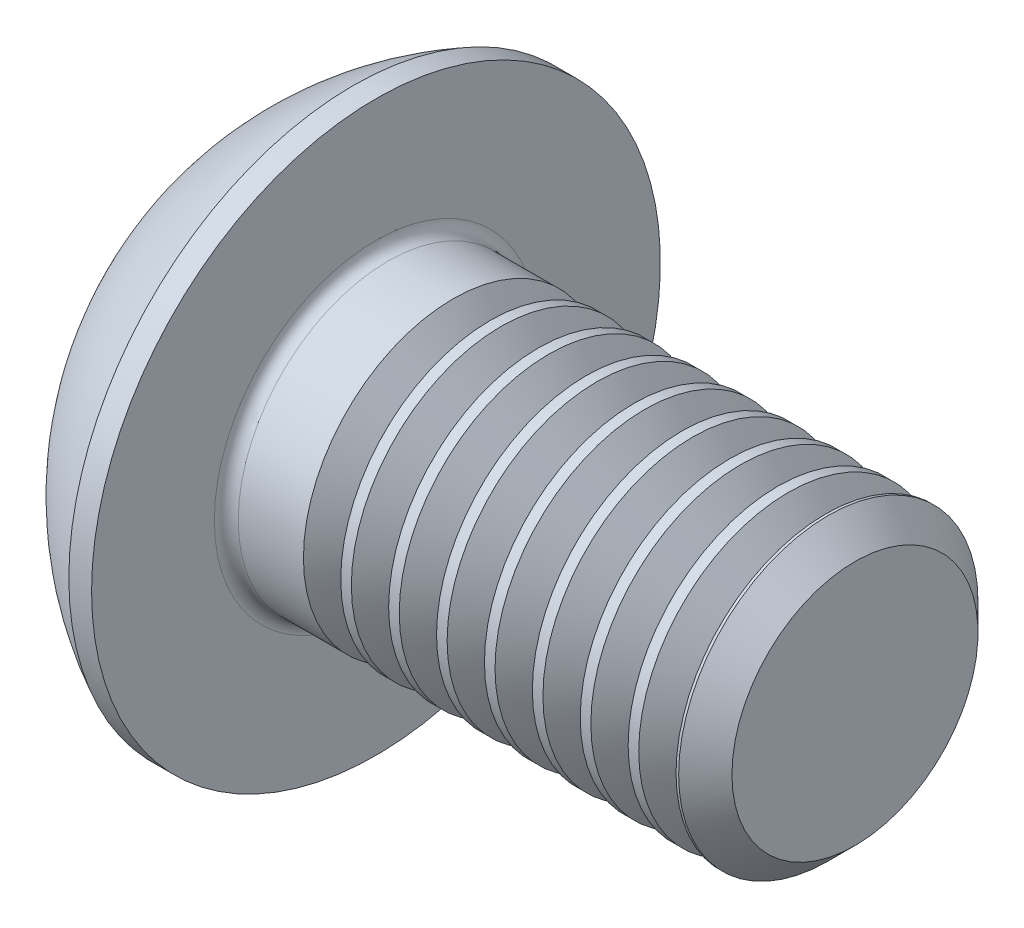
ISO-10303-21;
HEADER;
FILE_DESCRIPTION(('STEP AP214'),'2;1');
FILE_NAME('part.step','',(''),(''),'','','');
FILE_SCHEMA(('AUTOMOTIVE_DESIGN { 1 0 10303 214 1 1 1 1 }'));
ENDSEC;
DATA;
#1=APPLICATION_CONTEXT('core data for automotive mechanical design processes');
#2=APPLICATION_PROTOCOL_DEFINITION('international standard','automotive_design',2000,#1);
#3=PRODUCT_CONTEXT('',#1,'mechanical');
#4=PRODUCT('Part','Part','',(#3));
#5=PRODUCT_RELATED_PRODUCT_CATEGORY('part','',(#4));
#6=PRODUCT_DEFINITION_FORMATION('','',#4);
#7=PRODUCT_DEFINITION_CONTEXT('part definition',#1,'design');
#8=PRODUCT_DEFINITION('design','',#6,#7);
#9=PRODUCT_DEFINITION_SHAPE('','',#8);
#10=(LENGTH_UNIT() NAMED_UNIT(*) SI_UNIT(.MILLI.,.METRE.));
#11=(NAMED_UNIT(*) PLANE_ANGLE_UNIT() SI_UNIT($,.RADIAN.));
#12=(NAMED_UNIT(*) SI_UNIT($,.STERADIAN.) SOLID_ANGLE_UNIT());
#13=UNCERTAINTY_MEASURE_WITH_UNIT(LENGTH_MEASURE(1.E-05),#10,'distance_accuracy_value','');
#14=(GEOMETRIC_REPRESENTATION_CONTEXT(3) GLOBAL_UNCERTAINTY_ASSIGNED_CONTEXT((#13)) GLOBAL_UNIT_ASSIGNED_CONTEXT((#10,
#11,#12)) REPRESENTATION_CONTEXT('',''));
#15=CARTESIAN_POINT('',(0.,0.,0.));
#16=DIRECTION('',(0.,0.,1.));
#17=DIRECTION('',(1.,0.,0.));
#18=AXIS2_PLACEMENT_3D('',#15,#16,#17);
#19=CARTESIAN_POINT('',(0.,0.,0.));
#20=DIRECTION('',(-1.,0.,0.));
#21=DIRECTION('',(0.,0.,1.));
#22=AXIS2_PLACEMENT_3D('',#19,#20,#21);
#23=PLANE('',#22);
#24=CARTESIAN_POINT('',(0.,0.,0.));
#25=DIRECTION('',(-1.,0.,0.));
#26=DIRECTION('',(0.,0.,1.));
#27=AXIS2_PLACEMENT_3D('',#24,#25,#26);
#28=CIRCLE('',#27,2.375);
#29=CARTESIAN_POINT('',(0.,2.375,0.));
#30=VERTEX_POINT('',#29);
#31=EDGE_CURVE('E155',#30,#30,#28,.T.);
#32=ORIENTED_EDGE('',*,*,#31,.T.);
#33=EDGE_LOOP('',(#32));
#34=FACE_BOUND('',#33,.T.);
#35=DIRECTION('',(0.,-1.,0.));
#36=VECTOR('',#35,1.);
#37=CARTESIAN_POINT('',(0.,-0.866025403784438,1.5));
#38=LINE('',#37,#36);
#39=CARTESIAN_POINT('',(0.,0.866025403784439,1.5));
#40=VERTEX_POINT('',#39);
#41=CARTESIAN_POINT('',(0.,-0.866025403784438,1.5));
#42=VERTEX_POINT('',#41);
#43=EDGE_CURVE('E50',#40,#42,#38,.T.);
#44=ORIENTED_EDGE('',*,*,#43,.T.);
#45=DIRECTION('',(0.,-0.500000000000001,-0.866025403784438));
#46=VECTOR('',#45,1.);
#47=CARTESIAN_POINT('',(0.,-1.73205080756888,0.));
#48=LINE('',#47,#46);
#49=CARTESIAN_POINT('',(0.,-1.73205080756888,0.));
#50=VERTEX_POINT('',#49);
#51=EDGE_CURVE('E372',#42,#50,#48,.T.);
#52=ORIENTED_EDGE('',*,*,#51,.T.);
#53=DIRECTION('',(0.,0.500000000000001,-0.866025403784438));
#54=VECTOR('',#53,1.);
#55=CARTESIAN_POINT('',(0.,-0.866025403784438,-1.5));
#56=LINE('',#55,#54);
#57=CARTESIAN_POINT('',(0.,-0.866025403784438,-1.5));
#58=VERTEX_POINT('',#57);
#59=EDGE_CURVE('E130',#50,#58,#56,.T.);
#60=ORIENTED_EDGE('',*,*,#59,.T.);
#61=DIRECTION('',(0.,1.,0.));
#62=VECTOR('',#61,1.);
#63=CARTESIAN_POINT('',(0.,0.866025403784439,-1.5));
#64=LINE('',#63,#62);
#65=CARTESIAN_POINT('',(0.,0.866025403784439,-1.5));
#66=VERTEX_POINT('',#65);
#67=EDGE_CURVE('E392',#58,#66,#64,.T.);
#68=ORIENTED_EDGE('',*,*,#67,.T.);
#69=DIRECTION('',(0.,0.5,0.866025403784439));
#70=VECTOR('',#69,1.);
#71=CARTESIAN_POINT('',(0.,1.73205080756888,0.));
#72=LINE('',#71,#70);
#73=CARTESIAN_POINT('',(0.,1.73205080756888,0.));
#74=VERTEX_POINT('',#73);
#75=EDGE_CURVE('E394',#66,#74,#72,.T.);
#76=ORIENTED_EDGE('',*,*,#75,.T.);
#77=DIRECTION('',(0.,-0.5,0.866025403784439));
#78=VECTOR('',#77,1.);
#79=CARTESIAN_POINT('',(0.,0.866025403784439,1.5));
#80=LINE('',#79,#78);
#81=EDGE_CURVE('E396',#74,#40,#80,.T.);
#82=ORIENTED_EDGE('',*,*,#81,.T.);
#83=EDGE_LOOP('',(#44,#52,#60,#68,#76,#82));
#84=FACE_BOUND('',#83,.T.);
#85=ADVANCED_FACE('F35',(#34,#84),#23,.T.);
#86=CARTESIAN_POINT('',(4.75501582278481,0.,0.));
#87=DIRECTION('',(-1.,0.,0.));
#88=DIRECTION('',(0.,1.,0.));
#89=AXIS2_PLACEMENT_3D('',#86,#87,#88);
#90=SPHERICAL_SURFACE('',#89,5.3151482081814);
#91=CARTESIAN_POINT('',(2.37,0.,0.));
#92=DIRECTION('',(-1.,0.,0.));
#93=DIRECTION('',(0.,0.,1.));
#94=AXIS2_PLACEMENT_3D('',#91,#92,#93);
#95=CIRCLE('',#94,4.75);
#96=CARTESIAN_POINT('',(2.37,4.75,0.));
#97=VERTEX_POINT('',#96);
#98=EDGE_CURVE('E152',#97,#97,#95,.T.);
#99=CARTESIAN_POINT('',(2.37,4.75,0.));
#100=CARTESIAN_POINT('',(2.33822259048669,4.7340443473251,0.));
#101=CARTESIAN_POINT('',(2.30660534291523,4.71776971995817,0.));
#102=CARTESIAN_POINT('',(2.24370380094997,4.68458927158339,0.));
#103=CARTESIAN_POINT('',(2.21241950655618,4.66768345057554,0.));
#104=CARTESIAN_POINT('',(2.15019650024021,4.6332473706621,0.));
#105=CARTESIAN_POINT('',(2.11925778831804,4.6157171117565,0.));
#106=CARTESIAN_POINT('',(2.05773840110808,4.58003923142985,0.));
#107=CARTESIAN_POINT('',(2.02715772582028,4.56189161000879,0.));
#108=CARTESIAN_POINT('',(1.96636673145741,4.52498631044657,0.));
#109=CARTESIAN_POINT('',(1.93615641238234,4.50622863230542,0.));
#110=CARTESIAN_POINT('',(1.87611829826807,4.46811077571318,0.));
#111=CARTESIAN_POINT('',(1.84629050322887,4.4487505972621,0.));
#112=CARTESIAN_POINT('',(1.78702945162455,4.40943553782984,0.));
#113=CARTESIAN_POINT('',(1.75759619505941,4.38948065684866,0.));
#114=CARTESIAN_POINT('',(1.69913607574061,4.34898423002648,0.));
#115=CARTESIAN_POINT('',(1.67010921298694,4.32844268418549,0.));
#116=CARTESIAN_POINT('',(1.61247357298735,4.28678120152175,0.));
#117=CARTESIAN_POINT('',(1.58386479574144,4.265661264699,0.));
#118=CARTESIAN_POINT('',(1.52707685004032,4.22285150694424,0.));
#119=CARTESIAN_POINT('',(1.49889768158512,4.20116168601223,0.));
#120=CARTESIAN_POINT('',(1.44298030371049,4.15722089644741,0.));
#121=CARTESIAN_POINT('',(1.41524209429107,4.13496992781461,0.));
#122=CARTESIAN_POINT('',(1.36021780711889,4.08991580528235,0.));
#123=CARTESIAN_POINT('',(1.33293172936613,4.06711265138288,0.));
#124=CARTESIAN_POINT('',(1.278822696045,4.02096334316478,0.));
#125=CARTESIAN_POINT('',(1.25199974047662,3.99761718884614,0.));
#126=CARTESIAN_POINT('',(1.19882775550162,3.95039128335163,0.));
#127=CARTESIAN_POINT('',(1.172478726095,3.92651153217576,0.));
#128=CARTESIAN_POINT('',(1.1202652065289,3.87822805145535,0.));
#129=CARTESIAN_POINT('',(1.09440071636942,3.85382432191081,0.));
#130=CARTESIAN_POINT('',(1.04316669321618,3.8045027139941,0.));
#131=CARTESIAN_POINT('',(1.01779716022241,3.77958483562192,0.));
#132=CARTESIAN_POINT('',(0.9675632699561,3.72924496668416,0.));
#133=CARTESIAN_POINT('',(0.942698912683561,3.70382297611859,0.));
#134=CARTESIAN_POINT('',(0.893485388936279,3.65248512247887,0.));
#135=CARTESIAN_POINT('',(0.869136222461536,3.62656925940472,0.));
#136=CARTESIAN_POINT('',(0.82096288787349,3.57425409935884,0.));
#137=CARTESIAN_POINT('',(0.797138719760188,3.54785480238711,0.));
#138=CARTESIAN_POINT('',(0.750024977995378,3.49458340787865,0.));
#139=CARTESIAN_POINT('',(0.72673540434387,3.46771131034191,0.));
#140=CARTESIAN_POINT('',(0.680700232274541,3.41350513847464,0.));
#141=CARTESIAN_POINT('',(0.657954633856721,3.3861710641441,0.));
#142=CARTESIAN_POINT('',(0.613016573919583,3.33105194853939,0.));
#143=CARTESIAN_POINT('',(0.590824112400264,3.30326690726522,0.));
#144=CARTESIAN_POINT('',(0.547001265128255,3.24725704926748,0.));
#145=CARTESIAN_POINT('',(0.525370879375565,3.21903223254391,0.));
#146=CARTESIAN_POINT('',(0.482680896105489,3.16215419227902,0.));
#147=CARTESIAN_POINT('',(0.461621298588105,3.13350096873769,0.));
#148=CARTESIAN_POINT('',(0.420081374357154,3.07577765602272,0.));
#149=CARTESIAN_POINT('',(0.399601047643587,3.04670756684908,0.));
#150=CARTESIAN_POINT('',(0.359227914239947,2.98816223197683,0.));
#151=CARTESIAN_POINT('',(0.339335107549873,2.95868698627822,0.));
#152=CARTESIAN_POINT('',(0.300145026860788,2.89934321060632,0.));
#153=CARTESIAN_POINT('',(0.280847752861777,2.86947468063304,0.));
#154=CARTESIAN_POINT('',(0.24285650999714,2.80935636725696,0.));
#155=CARTESIAN_POINT('',(0.224162541131515,2.77910658385417,0.));
#156=CARTESIAN_POINT('',(0.187385439283607,2.71823794734018,0.));
#157=CARTESIAN_POINT('',(0.169302306301325,2.68761909422898,0.));
#158=CARTESIAN_POINT('',(0.133754156035989,2.626024653246,0.));
#159=CARTESIAN_POINT('',(0.116289138752934,2.59504906537422,0.));
#160=CARTESIAN_POINT('',(0.081984269005742,2.53275362391635,0.));
#161=CARTESIAN_POINT('',(0.065144416541604,2.50143377033028,0.));
#162=CARTESIAN_POINT('',(0.0320966055444301,2.43846244094735,0.));
#163=CARTESIAN_POINT('',(0.0158886470113941,2.40681096515049,0.));
#164=CARTESIAN_POINT('',(0.,2.375,0.));
#165=B_SPLINE_CURVE_WITH_KNOTS('',3,(#99,#100,#101,#102,#103,#104,#105,#106,#107,#108,#109,#110,
#111,#112,#113,#114,#115,#116,#117,#118,#119,#120,#121,#122,#123,#124,#125,#126,#127,#128,#129,
#130,#131,#132,#133,#134,#135,#136,#137,#138,#139,#140,#141,#142,#143,#144,#145,#146,#147,#148,
#149,#150,#151,#152,#153,#154,#155,#156,#157,#158,#159,#160,#161,#162,#163,#164),.UNSPECIFIED.,
.F.,.F.,(4,2,2,2,2,2,2,2,2,2,2,2,2,2,2,2,2,2,2,2,2,2,2,2,2,2,2,2,2,2,2,2,4),(0.,
0.106672849678273,0.213345699356545,0.320018549034817,0.42669139871309,0.533364248391363,
0.640037098069634,0.746709947747907,0.85338279742618,0.960055647104452,1.06672849678273,
1.173401346461,1.28007419613927,1.38674704581754,1.49341989549581,1.60009274517409,
1.70676559485236,1.81343844453063,1.9201112942089,2.02678414388718,2.13345699356545,
2.24012984324372,2.34680269292199,2.45347554260027,2.56014839227854,2.66682124195681,
2.77349409163508,2.88016694131336,2.98683979099163,3.0935126406699,3.20018549034817,
3.30685834002645,3.41353118970472),.UNSPECIFIED.);
#166=EDGE_CURVE('BSEAM177',#97,#30,#165,.T.);
#167=ORIENTED_EDGE('',*,*,#98,.T.);
#168=ORIENTED_EDGE('',*,*,#31,.F.);
#169=ORIENTED_EDGE('',*,*,#166,.T.);
#170=ORIENTED_EDGE('',*,*,#166,.F.);
#171=EDGE_LOOP('',(#167,#169,#168,#170));
#172=FACE_BOUND('',#171,.T.);
#173=ADVANCED_FACE('F177',(#172),#90,.T.);
#174=CARTESIAN_POINT('',(0.,0.,0.));
#175=DIRECTION('',(-1.,0.,0.));
#176=DIRECTION('',(0.,0.,1.));
#177=AXIS2_PLACEMENT_3D('',#174,#175,#176);
#178=CYLINDRICAL_SURFACE('',#177,4.75);
#179=ORIENTED_EDGE('',*,*,#98,.F.);
#180=EDGE_LOOP('',(#179));
#181=FACE_BOUND('',#180,.T.);
#182=CARTESIAN_POINT('',(2.75,0.,0.));
#183=DIRECTION('',(-1.,0.,0.));
#184=DIRECTION('',(0.,0.,1.));
#185=AXIS2_PLACEMENT_3D('',#182,#183,#184);
#186=CIRCLE('',#185,4.75);
#187=CARTESIAN_POINT('',(2.75,0.,4.75));
#188=VERTEX_POINT('',#187);
#189=EDGE_CURVE('E149',#188,#188,#186,.T.);
#190=ORIENTED_EDGE('',*,*,#189,.T.);
#191=EDGE_LOOP('',(#190));
#192=FACE_BOUND('',#191,.T.);
#193=ADVANCED_FACE('F182',(#181,#192),#178,.T.);
#194=CARTESIAN_POINT('',(2.75,2.5,0.));
#195=DIRECTION('',(-1.,0.,0.));
#196=DIRECTION('',(0.,0.,1.));
#197=AXIS2_PLACEMENT_3D('',#194,#195,#196);
#198=PLANE('',#197);
#199=CARTESIAN_POINT('',(2.75,0.,0.));
#200=DIRECTION('',(-1.,0.,0.));
#201=DIRECTION('',(0.,0.,1.));
#202=AXIS2_PLACEMENT_3D('',#199,#200,#201);
#203=CIRCLE('',#202,2.7);
#204=CARTESIAN_POINT('',(2.75,0.,2.7));
#205=VERTEX_POINT('',#204);
#206=EDGE_CURVE('E43',#205,#205,#203,.T.);
#207=ORIENTED_EDGE('',*,*,#206,.T.);
#208=EDGE_LOOP('',(#207));
#209=FACE_BOUND('',#208,.T.);
#210=ORIENTED_EDGE('',*,*,#189,.F.);
#211=EDGE_LOOP('',(#210));
#212=FACE_BOUND('',#211,.T.);
#213=ADVANCED_FACE('F160',(#209,#212),#198,.F.);
#214=CARTESIAN_POINT('',(0.,0.,0.));
#215=DIRECTION('',(-1.,0.,0.));
#216=DIRECTION('',(0.,0.,1.));
#217=AXIS2_PLACEMENT_3D('',#214,#215,#216);
#218=CYLINDRICAL_SURFACE('',#217,2.5);
#219=CARTESIAN_POINT('',(4.03840764549668,0.,0.));
#220=DIRECTION('',(-1.,0.,0.));
#221=DIRECTION('',(0.,-1.,0.));
#222=AXIS2_PLACEMENT_3D('',#219,#220,#221);
#223=CIRCLE('',#222,2.5);
#224=CARTESIAN_POINT('',(4.03840764549668,-2.5,0.));
#225=VERTEX_POINT('',#224);
#226=EDGE_CURVE('E367',#225,#225,#223,.T.);
#227=ORIENTED_EDGE('',*,*,#226,.T.);
#228=EDGE_LOOP('',(#227));
#229=FACE_BOUND('',#228,.T.);
#230=CARTESIAN_POINT('',(2.95,0.,0.));
#231=DIRECTION('',(-1.,0.,0.));
#232=DIRECTION('',(0.,0.,1.));
#233=AXIS2_PLACEMENT_3D('',#230,#231,#232);
#234=CIRCLE('',#233,2.5);
#235=CARTESIAN_POINT('',(2.95,0.,2.5));
#236=VERTEX_POINT('',#235);
#237=EDGE_CURVE('E11',#236,#236,#234,.F.);
#238=ORIENTED_EDGE('',*,*,#237,.T.);
#239=EDGE_LOOP('',(#238));
#240=FACE_BOUND('',#239,.T.);
#241=ADVANCED_FACE('F164',(#229,#240),#218,.T.);
#242=CARTESIAN_POINT('',(2.95,0.,0.));
#243=DIRECTION('',(-1.,0.,0.));
#244=DIRECTION('',(0.,0.,1.));
#245=AXIS2_PLACEMENT_3D('',#242,#243,#244);
#246=TOROIDAL_SURFACE('',#245,2.7,0.2);
#247=ORIENTED_EDGE('',*,*,#237,.F.);
#248=EDGE_LOOP('',(#247));
#249=FACE_BOUND('',#248,.T.);
#250=ORIENTED_EDGE('',*,*,#206,.F.);
#251=EDGE_LOOP('',(#250));
#252=FACE_BOUND('',#251,.T.);
#253=ADVANCED_FACE('F37',(#249,#252),#246,.F.);
#254=CARTESIAN_POINT('',(1.56,-1.73205080756888,0.));
#255=DIRECTION('',(0.,0.866025403784438,-0.500000000000001));
#256=DIRECTION('',(0.,0.500000000000001,0.866025403784438));
#257=AXIS2_PLACEMENT_3D('',#254,#255,#256);
#258=PLANE('',#257);
#259=DIRECTION('',(0.,-0.500000000000001,-0.866025403784438));
#260=VECTOR('',#259,1.);
#261=CARTESIAN_POINT('',(1.56,-1.73205080756888,0.));
#262=LINE('',#261,#260);
#263=CARTESIAN_POINT('',(1.56,-0.866025403784438,1.5));
#264=VERTEX_POINT('',#263);
#265=CARTESIAN_POINT('',(1.56,-1.29903810567666,0.750000000000002));
#266=VERTEX_POINT('',#265);
#267=EDGE_CURVE('E116',#264,#266,#262,.T.);
#268=ORIENTED_EDGE('',*,*,#267,.T.);
#269=CARTESIAN_POINT('',(1.56,-1.73205080756888,0.));
#270=VERTEX_POINT('',#269);
#271=EDGE_CURVE('E111',#266,#270,#262,.T.);
#272=ORIENTED_EDGE('',*,*,#271,.T.);
#273=DIRECTION('',(-1.,0.,0.));
#274=VECTOR('',#273,1.);
#275=CARTESIAN_POINT('',(1.56,-1.73205080756888,0.));
#276=LINE('',#275,#274);
#277=EDGE_CURVE('E113',#270,#50,#276,.T.);
#278=ORIENTED_EDGE('',*,*,#277,.T.);
#279=ORIENTED_EDGE('',*,*,#51,.F.);
#280=DIRECTION('',(-1.,0.,0.));
#281=VECTOR('',#280,1.);
#282=CARTESIAN_POINT('',(1.56,-0.866025403784438,1.5));
#283=LINE('',#282,#281);
#284=EDGE_CURVE('E389',#264,#42,#283,.T.);
#285=ORIENTED_EDGE('',*,*,#284,.F.);
#286=EDGE_LOOP('',(#268,#272,#278,#279,#285));
#287=FACE_BOUND('',#286,.T.);
#288=ADVANCED_FACE('F112',(#287),#258,.T.);
#289=CARTESIAN_POINT('',(1.56,-0.866025403784438,-1.5));
#290=DIRECTION('',(0.,0.866025403784438,0.500000000000001));
#291=DIRECTION('',(0.,-0.500000000000001,0.866025403784438));
#292=AXIS2_PLACEMENT_3D('',#289,#290,#291);
#293=PLANE('',#292);
#294=DIRECTION('',(0.,0.500000000000001,-0.866025403784438));
#295=VECTOR('',#294,1.);
#296=CARTESIAN_POINT('',(1.56,-0.866025403784438,-1.5));
#297=LINE('',#296,#295);
#298=CARTESIAN_POINT('',(1.56,-1.29903810567666,-0.750000000000001));
#299=VERTEX_POINT('',#298);
#300=EDGE_CURVE('E58',#270,#299,#297,.T.);
#301=ORIENTED_EDGE('',*,*,#300,.T.);
#302=CARTESIAN_POINT('',(1.56,-0.866025403784438,-1.5));
#303=VERTEX_POINT('',#302);
#304=EDGE_CURVE('E125',#299,#303,#297,.T.);
#305=ORIENTED_EDGE('',*,*,#304,.T.);
#306=DIRECTION('',(-1.,0.,0.));
#307=VECTOR('',#306,1.);
#308=CARTESIAN_POINT('',(1.56,-0.866025403784438,-1.5));
#309=LINE('',#308,#307);
#310=EDGE_CURVE('E132',#303,#58,#309,.T.);
#311=ORIENTED_EDGE('',*,*,#310,.T.);
#312=ORIENTED_EDGE('',*,*,#59,.F.);
#313=ORIENTED_EDGE('',*,*,#277,.F.);
#314=EDGE_LOOP('',(#301,#305,#311,#312,#313));
#315=FACE_BOUND('',#314,.T.);
#316=ADVANCED_FACE('F128',(#315),#293,.T.);
#317=CARTESIAN_POINT('',(1.56,0.866025403784439,-1.5));
#318=DIRECTION('',(0.,0.,1.));
#319=DIRECTION('',(1.,0.,0.));
#320=AXIS2_PLACEMENT_3D('',#317,#318,#319);
#321=PLANE('',#320);
#322=DIRECTION('',(0.,1.,0.));
#323=VECTOR('',#322,1.);
#324=CARTESIAN_POINT('',(1.56,0.866025403784439,-1.5));
#325=LINE('',#324,#323);
#326=CARTESIAN_POINT('',(1.56,0.,-1.5));
#327=VERTEX_POINT('',#326);
#328=EDGE_CURVE('E374',#303,#327,#325,.T.);
#329=ORIENTED_EDGE('',*,*,#328,.T.);
#330=CARTESIAN_POINT('',(1.56,0.866025403784439,-1.5));
#331=VERTEX_POINT('',#330);
#332=EDGE_CURVE('E124',#327,#331,#325,.T.);
#333=ORIENTED_EDGE('',*,*,#332,.T.);
#334=DIRECTION('',(-1.,0.,0.));
#335=VECTOR('',#334,1.);
#336=CARTESIAN_POINT('',(1.56,0.866025403784439,-1.5));
#337=LINE('',#336,#335);
#338=EDGE_CURVE('E137',#331,#66,#337,.T.);
#339=ORIENTED_EDGE('',*,*,#338,.T.);
#340=ORIENTED_EDGE('',*,*,#67,.F.);
#341=ORIENTED_EDGE('',*,*,#310,.F.);
#342=EDGE_LOOP('',(#329,#333,#339,#340,#341));
#343=FACE_BOUND('',#342,.T.);
#344=ADVANCED_FACE('F208',(#343),#321,.T.);
#345=CARTESIAN_POINT('',(1.56,1.73205080756888,0.));
#346=DIRECTION('',(0.,-0.866025403784439,0.5));
#347=DIRECTION('',(0.,-0.5,-0.866025403784439));
#348=AXIS2_PLACEMENT_3D('',#345,#346,#347);
#349=PLANE('',#348);
#350=DIRECTION('',(0.,0.5,0.866025403784439));
#351=VECTOR('',#350,1.);
#352=CARTESIAN_POINT('',(1.56,1.73205080756888,0.));
#353=LINE('',#352,#351);
#354=CARTESIAN_POINT('',(1.56,1.29903810567666,-0.75));
#355=VERTEX_POINT('',#354);
#356=EDGE_CURVE('E378',#331,#355,#353,.T.);
#357=ORIENTED_EDGE('',*,*,#356,.T.);
#358=CARTESIAN_POINT('',(1.56,1.73205080756888,0.));
#359=VERTEX_POINT('',#358);
#360=EDGE_CURVE('E377',#355,#359,#353,.T.);
#361=ORIENTED_EDGE('',*,*,#360,.T.);
#362=DIRECTION('',(-1.,0.,0.));
#363=VECTOR('',#362,1.);
#364=CARTESIAN_POINT('',(1.56,1.73205080756888,0.));
#365=LINE('',#364,#363);
#366=EDGE_CURVE('E404',#359,#74,#365,.T.);
#367=ORIENTED_EDGE('',*,*,#366,.T.);
#368=ORIENTED_EDGE('',*,*,#75,.F.);
#369=ORIENTED_EDGE('',*,*,#338,.F.);
#370=EDGE_LOOP('',(#357,#361,#367,#368,#369));
#371=FACE_BOUND('',#370,.T.);
#372=ADVANCED_FACE('F211',(#371),#349,.T.);
#373=CARTESIAN_POINT('',(1.56,0.866025403784439,1.5));
#374=DIRECTION('',(0.,-0.866025403784439,-0.5));
#375=DIRECTION('',(0.,0.5,-0.866025403784439));
#376=AXIS2_PLACEMENT_3D('',#373,#374,#375);
#377=PLANE('',#376);
#378=DIRECTION('',(0.,-0.5,0.866025403784439));
#379=VECTOR('',#378,1.);
#380=CARTESIAN_POINT('',(1.56,0.866025403784439,1.5));
#381=LINE('',#380,#379);
#382=CARTESIAN_POINT('',(1.56,1.29903810567666,0.75));
#383=VERTEX_POINT('',#382);
#384=EDGE_CURVE('E382',#359,#383,#381,.T.);
#385=ORIENTED_EDGE('',*,*,#384,.T.);
#386=CARTESIAN_POINT('',(1.56,0.866025403784439,1.5));
#387=VERTEX_POINT('',#386);
#388=EDGE_CURVE('E381',#383,#387,#381,.T.);
#389=ORIENTED_EDGE('',*,*,#388,.T.);
#390=DIRECTION('',(-1.,0.,0.));
#391=VECTOR('',#390,1.);
#392=CARTESIAN_POINT('',(1.56,0.866025403784439,1.5));
#393=LINE('',#392,#391);
#394=EDGE_CURVE('E401',#387,#40,#393,.T.);
#395=ORIENTED_EDGE('',*,*,#394,.T.);
#396=ORIENTED_EDGE('',*,*,#81,.F.);
#397=ORIENTED_EDGE('',*,*,#366,.F.);
#398=EDGE_LOOP('',(#385,#389,#395,#396,#397));
#399=FACE_BOUND('',#398,.T.);
#400=ADVANCED_FACE('F215',(#399),#377,.T.);
#401=CARTESIAN_POINT('',(1.56,-0.866025403784438,1.5));
#402=DIRECTION('',(0.,0.,-1.));
#403=DIRECTION('',(-1.,0.,0.));
#404=AXIS2_PLACEMENT_3D('',#401,#402,#403);
#405=PLANE('',#404);
#406=DIRECTION('',(0.,-1.,0.));
#407=VECTOR('',#406,1.);
#408=CARTESIAN_POINT('',(1.56,-0.866025403784438,1.5));
#409=LINE('',#408,#407);
#410=CARTESIAN_POINT('',(1.56,0.,1.5));
#411=VERTEX_POINT('',#410);
#412=EDGE_CURVE('E386',#387,#411,#409,.T.);
#413=ORIENTED_EDGE('',*,*,#412,.T.);
#414=EDGE_CURVE('E385',#411,#264,#409,.T.);
#415=ORIENTED_EDGE('',*,*,#414,.T.);
#416=ORIENTED_EDGE('',*,*,#284,.T.);
#417=ORIENTED_EDGE('',*,*,#43,.F.);
#418=ORIENTED_EDGE('',*,*,#394,.F.);
#419=EDGE_LOOP('',(#413,#415,#416,#417,#418));
#420=FACE_BOUND('',#419,.T.);
#421=ADVANCED_FACE('F219',(#420),#405,.T.);
#422=CARTESIAN_POINT('',(1.56,-1.73205080756888,0.));
#423=DIRECTION('',(1.,0.,0.));
#424=DIRECTION('',(0.,0.,-1.));
#425=AXIS2_PLACEMENT_3D('',#422,#423,#424);
#426=PLANE('',#425);
#427=CARTESIAN_POINT('',(1.56,0.,0.));
#428=DIRECTION('',(-1.,0.,0.));
#429=DIRECTION('',(0.,0.,1.));
#430=AXIS2_PLACEMENT_3D('',#427,#428,#429);
#431=CIRCLE('',#430,1.5);
#432=EDGE_CURVE('E418',#355,#327,#431,.T.);
#433=ORIENTED_EDGE('',*,*,#432,.F.);
#434=ORIENTED_EDGE('',*,*,#356,.F.);
#435=ORIENTED_EDGE('',*,*,#332,.F.);
#436=EDGE_LOOP('',(#433,#434,#435));
#437=FACE_BOUND('',#436,.T.);
#438=ADVANCED_FACE('F223',(#437),#426,.F.);
#439=EDGE_CURVE('E143',#383,#355,#431,.T.);
#440=ORIENTED_EDGE('',*,*,#439,.F.);
#441=ORIENTED_EDGE('',*,*,#384,.F.);
#442=ORIENTED_EDGE('',*,*,#360,.F.);
#443=EDGE_LOOP('',(#440,#441,#442));
#444=FACE_BOUND('',#443,.T.);
#445=ADVANCED_FACE('F426',(#444),#426,.F.);
#446=EDGE_CURVE('E136',#411,#383,#431,.T.);
#447=ORIENTED_EDGE('',*,*,#446,.F.);
#448=ORIENTED_EDGE('',*,*,#412,.F.);
#449=ORIENTED_EDGE('',*,*,#388,.F.);
#450=EDGE_LOOP('',(#447,#448,#449));
#451=FACE_BOUND('',#450,.T.);
#452=ADVANCED_FACE('F429',(#451),#426,.F.);
#453=EDGE_CURVE('E131',#266,#411,#431,.T.);
#454=ORIENTED_EDGE('',*,*,#453,.F.);
#455=ORIENTED_EDGE('',*,*,#267,.F.);
#456=ORIENTED_EDGE('',*,*,#414,.F.);
#457=EDGE_LOOP('',(#454,#455,#456));
#458=FACE_BOUND('',#457,.T.);
#459=ADVANCED_FACE('F433',(#458),#426,.F.);
#460=EDGE_CURVE('E122',#299,#266,#431,.T.);
#461=ORIENTED_EDGE('',*,*,#460,.F.);
#462=ORIENTED_EDGE('',*,*,#300,.F.);
#463=ORIENTED_EDGE('',*,*,#271,.F.);
#464=EDGE_LOOP('',(#461,#462,#463));
#465=FACE_BOUND('',#464,.T.);
#466=ADVANCED_FACE('F121',(#465),#426,.F.);
#467=EDGE_CURVE('E417',#327,#299,#431,.T.);
#468=ORIENTED_EDGE('',*,*,#467,.F.);
#469=ORIENTED_EDGE('',*,*,#328,.F.);
#470=ORIENTED_EDGE('',*,*,#304,.F.);
#471=EDGE_LOOP('',(#468,#469,#470));
#472=FACE_BOUND('',#471,.T.);
#473=ADVANCED_FACE('F203',(#472),#426,.F.);
#474=CARTESIAN_POINT('',(2.42602540378445,0.,0.));
#475=DIRECTION('',(-1.,0.,0.));
#476=DIRECTION('',(0.,0.,1.));
#477=AXIS2_PLACEMENT_3D('',#474,#475,#476);
#478=CONICAL_SURFACE('',#477,0.,1.04719755119659);
#479=ORIENTED_EDGE('',*,*,#446,.T.);
#480=ORIENTED_EDGE('',*,*,#439,.T.);
#481=ORIENTED_EDGE('',*,*,#432,.T.);
#482=ORIENTED_EDGE('',*,*,#467,.T.);
#483=ORIENTED_EDGE('',*,*,#460,.T.);
#484=ORIENTED_EDGE('',*,*,#453,.T.);
#485=EDGE_LOOP('',(#479,#480,#481,#482,#483,#484));
#486=FACE_BOUND('',#485,.T.);
#487=CARTESIAN_POINT('',(2.42602540378445,0.,0.));
#488=VERTEX_POINT('',#487);
#489=VERTEX_LOOP('',#488);
#490=FACE_BOUND('',#489,.T.);
#491=ADVANCED_FACE('F200',(#486,#490),#478,.F.);
#492=CARTESIAN_POINT('',(4.66159235450332,0.,0.));
#493=DIRECTION('',(1.,0.,0.));
#494=DIRECTION('',(0.,1.,0.));
#495=AXIS2_PLACEMENT_3D('',#492,#493,#494);
#496=CONICAL_SURFACE('',#495,2.5,0.959931088596882);
#497=CARTESIAN_POINT('',(4.35,0.,0.));
#498=DIRECTION('',(-1.,0.,0.));
#499=DIRECTION('',(0.,-1.,0.));
#500=AXIS2_PLACEMENT_3D('',#497,#498,#499);
#501=CIRCLE('',#500,2.055);
#502=CARTESIAN_POINT('',(4.35,-2.055,0.));
#503=VERTEX_POINT('',#502);
#504=EDGE_CURVE('E364',#503,#503,#501,.T.);
#505=ORIENTED_EDGE('',*,*,#504,.F.);
#506=EDGE_LOOP('',(#505));
#507=FACE_BOUND('',#506,.T.);
#508=CARTESIAN_POINT('',(4.66159235450332,0.,0.));
#509=DIRECTION('',(-1.,0.,0.));
#510=DIRECTION('',(0.,-1.,0.));
#511=AXIS2_PLACEMENT_3D('',#508,#509,#510);
#512=CIRCLE('',#511,2.5);
#513=CARTESIAN_POINT('',(4.66159235450332,-2.5,0.));
#514=VERTEX_POINT('',#513);
#515=EDGE_CURVE('E370',#514,#514,#512,.T.);
#516=ORIENTED_EDGE('',*,*,#515,.T.);
#517=EDGE_LOOP('',(#516));
#518=FACE_BOUND('',#517,.T.);
#519=ADVANCED_FACE('F202',(#507,#518),#496,.T.);
#520=CARTESIAN_POINT('',(4.35,0.,0.));
#521=DIRECTION('',(-1.,0.,0.));
#522=DIRECTION('',(0.,-1.,0.));
#523=AXIS2_PLACEMENT_3D('',#520,#521,#522);
#524=CONICAL_SURFACE('',#523,2.055,0.959931088596877);
#525=ORIENTED_EDGE('',*,*,#226,.F.);
#526=EDGE_LOOP('',(#525));
#527=FACE_BOUND('',#526,.T.);
#528=ORIENTED_EDGE('',*,*,#504,.T.);
#529=EDGE_LOOP('',(#528));
#530=FACE_BOUND('',#529,.T.);
#531=ADVANCED_FACE('F230',(#527,#530),#524,.T.);
#532=CARTESIAN_POINT('',(4.83840764549668,0.,0.));
#533=DIRECTION('',(-1.,0.,0.));
#534=DIRECTION('',(0.,-1.,0.));
#535=AXIS2_PLACEMENT_3D('',#532,#533,#534);
#536=CIRCLE('',#535,2.5);
#537=CARTESIAN_POINT('',(4.83840764549668,-2.5,0.));
#538=VERTEX_POINT('',#537);
#539=EDGE_CURVE('E358',#538,#538,#536,.T.);
#540=ORIENTED_EDGE('',*,*,#539,.T.);
#541=EDGE_LOOP('',(#540));
#542=FACE_BOUND('',#541,.T.);
#543=ORIENTED_EDGE('',*,*,#515,.F.);
#544=EDGE_LOOP('',(#543));
#545=FACE_BOUND('',#544,.T.);
#546=ADVANCED_FACE('F174',(#542,#545),#218,.T.);
#547=CARTESIAN_POINT('',(5.46159235450332,0.,0.));
#548=DIRECTION('',(1.,0.,0.));
#549=DIRECTION('',(0.,1.,0.));
#550=AXIS2_PLACEMENT_3D('',#547,#548,#549);
#551=CONICAL_SURFACE('',#550,2.5,0.959931088596882);
#552=CARTESIAN_POINT('',(5.15,0.,0.));
#553=DIRECTION('',(-1.,0.,0.));
#554=DIRECTION('',(0.,-1.,0.));
#555=AXIS2_PLACEMENT_3D('',#552,#553,#554);
#556=CIRCLE('',#555,2.055);
#557=CARTESIAN_POINT('',(5.15,-2.055,0.));
#558=VERTEX_POINT('',#557);
#559=EDGE_CURVE('E355',#558,#558,#556,.T.);
#560=ORIENTED_EDGE('',*,*,#559,.F.);
#561=EDGE_LOOP('',(#560));
#562=FACE_BOUND('',#561,.T.);
#563=CARTESIAN_POINT('',(5.46159235450332,0.,0.));
#564=DIRECTION('',(-1.,0.,0.));
#565=DIRECTION('',(0.,-1.,0.));
#566=AXIS2_PLACEMENT_3D('',#563,#564,#565);
#567=CIRCLE('',#566,2.5);
#568=CARTESIAN_POINT('',(5.46159235450332,-2.5,0.));
#569=VERTEX_POINT('',#568);
#570=EDGE_CURVE('E361',#569,#569,#567,.T.);
#571=ORIENTED_EDGE('',*,*,#570,.T.);
#572=EDGE_LOOP('',(#571));
#573=FACE_BOUND('',#572,.T.);
#574=ADVANCED_FACE('F235',(#562,#573),#551,.T.);
#575=CARTESIAN_POINT('',(5.15,0.,0.));
#576=DIRECTION('',(-1.,0.,0.));
#577=DIRECTION('',(0.,-1.,0.));
#578=AXIS2_PLACEMENT_3D('',#575,#576,#577);
#579=CONICAL_SURFACE('',#578,2.055,0.959931088596877);
#580=ORIENTED_EDGE('',*,*,#539,.F.);
#581=EDGE_LOOP('',(#580));
#582=FACE_BOUND('',#581,.T.);
#583=ORIENTED_EDGE('',*,*,#559,.T.);
#584=EDGE_LOOP('',(#583));
#585=FACE_BOUND('',#584,.T.);
#586=ADVANCED_FACE('F238',(#582,#585),#579,.T.);
#587=CARTESIAN_POINT('',(5.63840764549668,0.,0.));
#588=DIRECTION('',(-1.,0.,0.));
#589=DIRECTION('',(0.,-1.,0.));
#590=AXIS2_PLACEMENT_3D('',#587,#588,#589);
#591=CIRCLE('',#590,2.5);
#592=CARTESIAN_POINT('',(5.63840764549668,-2.5,0.));
#593=VERTEX_POINT('',#592);
#594=EDGE_CURVE('E349',#593,#593,#591,.T.);
#595=ORIENTED_EDGE('',*,*,#594,.T.);
#596=EDGE_LOOP('',(#595));
#597=FACE_BOUND('',#596,.T.);
#598=ORIENTED_EDGE('',*,*,#570,.F.);
#599=EDGE_LOOP('',(#598));
#600=FACE_BOUND('',#599,.T.);
#601=ADVANCED_FACE('F242',(#597,#600),#218,.T.);
#602=CARTESIAN_POINT('',(6.26159235450332,0.,0.));
#603=DIRECTION('',(1.,0.,0.));
#604=DIRECTION('',(0.,1.,0.));
#605=AXIS2_PLACEMENT_3D('',#602,#603,#604);
#606=CONICAL_SURFACE('',#605,2.5,0.959931088596882);
#607=CARTESIAN_POINT('',(5.95,0.,0.));
#608=DIRECTION('',(-1.,0.,0.));
#609=DIRECTION('',(0.,-1.,0.));
#610=AXIS2_PLACEMENT_3D('',#607,#608,#609);
#611=CIRCLE('',#610,2.055);
#612=CARTESIAN_POINT('',(5.95,-2.055,0.));
#613=VERTEX_POINT('',#612);
#614=EDGE_CURVE('E346',#613,#613,#611,.T.);
#615=ORIENTED_EDGE('',*,*,#614,.F.);
#616=EDGE_LOOP('',(#615));
#617=FACE_BOUND('',#616,.T.);
#618=CARTESIAN_POINT('',(6.26159235450332,0.,0.));
#619=DIRECTION('',(-1.,0.,0.));
#620=DIRECTION('',(0.,-1.,0.));
#621=AXIS2_PLACEMENT_3D('',#618,#619,#620);
#622=CIRCLE('',#621,2.5);
#623=CARTESIAN_POINT('',(6.26159235450332,-2.5,0.));
#624=VERTEX_POINT('',#623);
#625=EDGE_CURVE('E352',#624,#624,#622,.T.);
#626=ORIENTED_EDGE('',*,*,#625,.T.);
#627=EDGE_LOOP('',(#626));
#628=FACE_BOUND('',#627,.T.);
#629=ADVANCED_FACE('F244',(#617,#628),#606,.T.);
#630=CARTESIAN_POINT('',(5.95,0.,0.));
#631=DIRECTION('',(-1.,0.,0.));
#632=DIRECTION('',(0.,-1.,0.));
#633=AXIS2_PLACEMENT_3D('',#630,#631,#632);
#634=CONICAL_SURFACE('',#633,2.055,0.959931088596877);
#635=ORIENTED_EDGE('',*,*,#594,.F.);
#636=EDGE_LOOP('',(#635));
#637=FACE_BOUND('',#636,.T.);
#638=ORIENTED_EDGE('',*,*,#614,.T.);
#639=EDGE_LOOP('',(#638));
#640=FACE_BOUND('',#639,.T.);
#641=ADVANCED_FACE('F247',(#637,#640),#634,.T.);
#642=CARTESIAN_POINT('',(6.43840764549668,0.,0.));
#643=DIRECTION('',(-1.,0.,0.));
#644=DIRECTION('',(0.,-1.,0.));
#645=AXIS2_PLACEMENT_3D('',#642,#643,#644);
#646=CIRCLE('',#645,2.5);
#647=CARTESIAN_POINT('',(6.43840764549668,-2.5,0.));
#648=VERTEX_POINT('',#647);
#649=EDGE_CURVE('E340',#648,#648,#646,.T.);
#650=ORIENTED_EDGE('',*,*,#649,.T.);
#651=EDGE_LOOP('',(#650));
#652=FACE_BOUND('',#651,.T.);
#653=ORIENTED_EDGE('',*,*,#625,.F.);
#654=EDGE_LOOP('',(#653));
#655=FACE_BOUND('',#654,.T.);
#656=ADVANCED_FACE('F251',(#652,#655),#218,.T.);
#657=CARTESIAN_POINT('',(7.06159235450332,0.,0.));
#658=DIRECTION('',(1.,0.,0.));
#659=DIRECTION('',(0.,1.,0.));
#660=AXIS2_PLACEMENT_3D('',#657,#658,#659);
#661=CONICAL_SURFACE('',#660,2.5,0.959931088596882);
#662=CARTESIAN_POINT('',(6.75,0.,0.));
#663=DIRECTION('',(-1.,0.,0.));
#664=DIRECTION('',(0.,-1.,0.));
#665=AXIS2_PLACEMENT_3D('',#662,#663,#664);
#666=CIRCLE('',#665,2.055);
#667=CARTESIAN_POINT('',(6.75,-2.055,0.));
#668=VERTEX_POINT('',#667);
#669=EDGE_CURVE('E337',#668,#668,#666,.T.);
#670=ORIENTED_EDGE('',*,*,#669,.F.);
#671=EDGE_LOOP('',(#670));
#672=FACE_BOUND('',#671,.T.);
#673=CARTESIAN_POINT('',(7.06159235450332,0.,0.));
#674=DIRECTION('',(-1.,0.,0.));
#675=DIRECTION('',(0.,-1.,0.));
#676=AXIS2_PLACEMENT_3D('',#673,#674,#675);
#677=CIRCLE('',#676,2.5);
#678=CARTESIAN_POINT('',(7.06159235450332,-2.5,0.));
#679=VERTEX_POINT('',#678);
#680=EDGE_CURVE('E343',#679,#679,#677,.T.);
#681=ORIENTED_EDGE('',*,*,#680,.T.);
#682=EDGE_LOOP('',(#681));
#683=FACE_BOUND('',#682,.T.);
#684=ADVANCED_FACE('F253',(#672,#683),#661,.T.);
#685=CARTESIAN_POINT('',(6.75,0.,0.));
#686=DIRECTION('',(-1.,0.,0.));
#687=DIRECTION('',(0.,-1.,0.));
#688=AXIS2_PLACEMENT_3D('',#685,#686,#687);
#689=CONICAL_SURFACE('',#688,2.055,0.959931088596877);
#690=ORIENTED_EDGE('',*,*,#649,.F.);
#691=EDGE_LOOP('',(#690));
#692=FACE_BOUND('',#691,.T.);
#693=ORIENTED_EDGE('',*,*,#669,.T.);
#694=EDGE_LOOP('',(#693));
#695=FACE_BOUND('',#694,.T.);
#696=ADVANCED_FACE('F256',(#692,#695),#689,.T.);
#697=CARTESIAN_POINT('',(7.23840764549668,0.,0.));
#698=DIRECTION('',(-1.,0.,0.));
#699=DIRECTION('',(0.,-1.,0.));
#700=AXIS2_PLACEMENT_3D('',#697,#698,#699);
#701=CIRCLE('',#700,2.5);
#702=CARTESIAN_POINT('',(7.23840764549668,-2.5,0.));
#703=VERTEX_POINT('',#702);
#704=EDGE_CURVE('E331',#703,#703,#701,.T.);
#705=ORIENTED_EDGE('',*,*,#704,.T.);
#706=EDGE_LOOP('',(#705));
#707=FACE_BOUND('',#706,.T.);
#708=ORIENTED_EDGE('',*,*,#680,.F.);
#709=EDGE_LOOP('',(#708));
#710=FACE_BOUND('',#709,.T.);
#711=ADVANCED_FACE('F260',(#707,#710),#218,.T.);
#712=CARTESIAN_POINT('',(7.86159235450332,0.,0.));
#713=DIRECTION('',(1.,0.,0.));
#714=DIRECTION('',(0.,1.,0.));
#715=AXIS2_PLACEMENT_3D('',#712,#713,#714);
#716=CONICAL_SURFACE('',#715,2.5,0.959931088596882);
#717=CARTESIAN_POINT('',(7.55,0.,0.));
#718=DIRECTION('',(-1.,0.,0.));
#719=DIRECTION('',(0.,-1.,0.));
#720=AXIS2_PLACEMENT_3D('',#717,#718,#719);
#721=CIRCLE('',#720,2.055);
#722=CARTESIAN_POINT('',(7.55,-2.055,0.));
#723=VERTEX_POINT('',#722);
#724=EDGE_CURVE('E328',#723,#723,#721,.T.);
#725=ORIENTED_EDGE('',*,*,#724,.F.);
#726=EDGE_LOOP('',(#725));
#727=FACE_BOUND('',#726,.T.);
#728=CARTESIAN_POINT('',(7.86159235450332,0.,0.));
#729=DIRECTION('',(-1.,0.,0.));
#730=DIRECTION('',(0.,-1.,0.));
#731=AXIS2_PLACEMENT_3D('',#728,#729,#730);
#732=CIRCLE('',#731,2.5);
#733=CARTESIAN_POINT('',(7.86159235450332,-2.5,0.));
#734=VERTEX_POINT('',#733);
#735=EDGE_CURVE('E334',#734,#734,#732,.T.);
#736=ORIENTED_EDGE('',*,*,#735,.T.);
#737=EDGE_LOOP('',(#736));
#738=FACE_BOUND('',#737,.T.);
#739=ADVANCED_FACE('F262',(#727,#738),#716,.T.);
#740=CARTESIAN_POINT('',(7.55,0.,0.));
#741=DIRECTION('',(-1.,0.,0.));
#742=DIRECTION('',(0.,-1.,0.));
#743=AXIS2_PLACEMENT_3D('',#740,#741,#742);
#744=CONICAL_SURFACE('',#743,2.055,0.959931088596877);
#745=ORIENTED_EDGE('',*,*,#704,.F.);
#746=EDGE_LOOP('',(#745));
#747=FACE_BOUND('',#746,.T.);
#748=ORIENTED_EDGE('',*,*,#724,.T.);
#749=EDGE_LOOP('',(#748));
#750=FACE_BOUND('',#749,.T.);
#751=ADVANCED_FACE('F265',(#747,#750),#744,.T.);
#752=CARTESIAN_POINT('',(8.03840764549668,0.,0.));
#753=DIRECTION('',(-1.,0.,0.));
#754=DIRECTION('',(0.,-1.,0.));
#755=AXIS2_PLACEMENT_3D('',#752,#753,#754);
#756=CIRCLE('',#755,2.5);
#757=CARTESIAN_POINT('',(8.03840764549668,-2.5,0.));
#758=VERTEX_POINT('',#757);
#759=EDGE_CURVE('E322',#758,#758,#756,.T.);
#760=ORIENTED_EDGE('',*,*,#759,.T.);
#761=EDGE_LOOP('',(#760));
#762=FACE_BOUND('',#761,.T.);
#763=ORIENTED_EDGE('',*,*,#735,.F.);
#764=EDGE_LOOP('',(#763));
#765=FACE_BOUND('',#764,.T.);
#766=ADVANCED_FACE('F269',(#762,#765),#218,.T.);
#767=CARTESIAN_POINT('',(8.66159235450332,0.,0.));
#768=DIRECTION('',(1.,0.,0.));
#769=DIRECTION('',(0.,1.,0.));
#770=AXIS2_PLACEMENT_3D('',#767,#768,#769);
#771=CONICAL_SURFACE('',#770,2.5,0.959931088596882);
#772=CARTESIAN_POINT('',(8.35,0.,0.));
#773=DIRECTION('',(-1.,0.,0.));
#774=DIRECTION('',(0.,-1.,0.));
#775=AXIS2_PLACEMENT_3D('',#772,#773,#774);
#776=CIRCLE('',#775,2.055);
#777=CARTESIAN_POINT('',(8.35,-2.055,0.));
#778=VERTEX_POINT('',#777);
#779=EDGE_CURVE('E319',#778,#778,#776,.T.);
#780=ORIENTED_EDGE('',*,*,#779,.F.);
#781=EDGE_LOOP('',(#780));
#782=FACE_BOUND('',#781,.T.);
#783=CARTESIAN_POINT('',(8.66159235450332,0.,0.));
#784=DIRECTION('',(-1.,0.,0.));
#785=DIRECTION('',(0.,-1.,0.));
#786=AXIS2_PLACEMENT_3D('',#783,#784,#785);
#787=CIRCLE('',#786,2.5);
#788=CARTESIAN_POINT('',(8.66159235450332,-2.5,0.));
#789=VERTEX_POINT('',#788);
#790=EDGE_CURVE('E325',#789,#789,#787,.T.);
#791=ORIENTED_EDGE('',*,*,#790,.T.);
#792=EDGE_LOOP('',(#791));
#793=FACE_BOUND('',#792,.T.);
#794=ADVANCED_FACE('F271',(#782,#793),#771,.T.);
#795=CARTESIAN_POINT('',(8.35,0.,0.));
#796=DIRECTION('',(-1.,0.,0.));
#797=DIRECTION('',(0.,-1.,0.));
#798=AXIS2_PLACEMENT_3D('',#795,#796,#797);
#799=CONICAL_SURFACE('',#798,2.055,0.959931088596877);
#800=ORIENTED_EDGE('',*,*,#759,.F.);
#801=EDGE_LOOP('',(#800));
#802=FACE_BOUND('',#801,.T.);
#803=ORIENTED_EDGE('',*,*,#779,.T.);
#804=EDGE_LOOP('',(#803));
#805=FACE_BOUND('',#804,.T.);
#806=ADVANCED_FACE('F274',(#802,#805),#799,.T.);
#807=CARTESIAN_POINT('',(8.83840764549668,0.,0.));
#808=DIRECTION('',(-1.,0.,0.));
#809=DIRECTION('',(0.,-1.,0.));
#810=AXIS2_PLACEMENT_3D('',#807,#808,#809);
#811=CIRCLE('',#810,2.5);
#812=CARTESIAN_POINT('',(8.83840764549668,-2.5,0.));
#813=VERTEX_POINT('',#812);
#814=EDGE_CURVE('E313',#813,#813,#811,.T.);
#815=ORIENTED_EDGE('',*,*,#814,.T.);
#816=EDGE_LOOP('',(#815));
#817=FACE_BOUND('',#816,.T.);
#818=ORIENTED_EDGE('',*,*,#790,.F.);
#819=EDGE_LOOP('',(#818));
#820=FACE_BOUND('',#819,.T.);
#821=ADVANCED_FACE('F278',(#817,#820),#218,.T.);
#822=CARTESIAN_POINT('',(9.46159235450332,0.,0.));
#823=DIRECTION('',(1.,0.,0.));
#824=DIRECTION('',(0.,1.,0.));
#825=AXIS2_PLACEMENT_3D('',#822,#823,#824);
#826=CONICAL_SURFACE('',#825,2.5,0.959931088596882);
#827=CARTESIAN_POINT('',(9.15,0.,0.));
#828=DIRECTION('',(-1.,0.,0.));
#829=DIRECTION('',(0.,-1.,0.));
#830=AXIS2_PLACEMENT_3D('',#827,#828,#829);
#831=CIRCLE('',#830,2.055);
#832=CARTESIAN_POINT('',(9.15,-2.055,0.));
#833=VERTEX_POINT('',#832);
#834=EDGE_CURVE('E310',#833,#833,#831,.T.);
#835=ORIENTED_EDGE('',*,*,#834,.F.);
#836=EDGE_LOOP('',(#835));
#837=FACE_BOUND('',#836,.T.);
#838=CARTESIAN_POINT('',(9.46159235450332,0.,0.));
#839=DIRECTION('',(-1.,0.,0.));
#840=DIRECTION('',(0.,-1.,0.));
#841=AXIS2_PLACEMENT_3D('',#838,#839,#840);
#842=CIRCLE('',#841,2.5);
#843=CARTESIAN_POINT('',(9.46159235450332,-2.5,0.));
#844=VERTEX_POINT('',#843);
#845=EDGE_CURVE('E316',#844,#844,#842,.T.);
#846=ORIENTED_EDGE('',*,*,#845,.T.);
#847=EDGE_LOOP('',(#846));
#848=FACE_BOUND('',#847,.T.);
#849=ADVANCED_FACE('F280',(#837,#848),#826,.T.);
#850=CARTESIAN_POINT('',(9.15,0.,0.));
#851=DIRECTION('',(-1.,0.,0.));
#852=DIRECTION('',(0.,-1.,0.));
#853=AXIS2_PLACEMENT_3D('',#850,#851,#852);
#854=CONICAL_SURFACE('',#853,2.055,0.959931088596877);
#855=ORIENTED_EDGE('',*,*,#814,.F.);
#856=EDGE_LOOP('',(#855));
#857=FACE_BOUND('',#856,.T.);
#858=ORIENTED_EDGE('',*,*,#834,.T.);
#859=EDGE_LOOP('',(#858));
#860=FACE_BOUND('',#859,.T.);
#861=ADVANCED_FACE('F283',(#857,#860),#854,.T.);
#862=CARTESIAN_POINT('',(9.63840764549668,0.,0.));
#863=DIRECTION('',(-1.,0.,0.));
#864=DIRECTION('',(0.,-1.,0.));
#865=AXIS2_PLACEMENT_3D('',#862,#863,#864);
#866=CIRCLE('',#865,2.5);
#867=CARTESIAN_POINT('',(9.63840764549668,-2.5,0.));
#868=VERTEX_POINT('',#867);
#869=EDGE_CURVE('E300',#868,#868,#866,.T.);
#870=ORIENTED_EDGE('',*,*,#869,.T.);
#871=EDGE_LOOP('',(#870));
#872=FACE_BOUND('',#871,.T.);
#873=ORIENTED_EDGE('',*,*,#845,.F.);
#874=EDGE_LOOP('',(#873));
#875=FACE_BOUND('',#874,.T.);
#876=ADVANCED_FACE('F287',(#872,#875),#218,.T.);
#877=CARTESIAN_POINT('',(10.2615923545033,0.,0.));
#878=DIRECTION('',(1.,0.,0.));
#879=DIRECTION('',(0.,1.,0.));
#880=AXIS2_PLACEMENT_3D('',#877,#878,#879);
#881=CONICAL_SURFACE('',#880,2.5,0.959931088596882);
#882=CARTESIAN_POINT('',(9.95,0.,0.));
#883=DIRECTION('',(-1.,0.,0.));
#884=DIRECTION('',(0.,-1.,0.));
#885=AXIS2_PLACEMENT_3D('',#882,#883,#884);
#886=CIRCLE('',#885,2.055);
#887=CARTESIAN_POINT('',(9.95,-2.055,0.));
#888=VERTEX_POINT('',#887);
#889=EDGE_CURVE('E303',#888,#888,#886,.T.);
#890=ORIENTED_EDGE('',*,*,#889,.F.);
#891=EDGE_LOOP('',(#890));
#892=FACE_BOUND('',#891,.T.);
#893=CARTESIAN_POINT('',(10.2615923545033,0.,0.));
#894=DIRECTION('',(-1.,0.,0.));
#895=DIRECTION('',(0.,-1.,0.));
#896=AXIS2_PLACEMENT_3D('',#893,#894,#895);
#897=CIRCLE('',#896,2.5);
#898=CARTESIAN_POINT('',(10.2615923545033,-2.5,0.));
#899=VERTEX_POINT('',#898);
#900=EDGE_CURVE('E305',#899,#899,#897,.T.);
#901=ORIENTED_EDGE('',*,*,#900,.T.);
#902=EDGE_LOOP('',(#901));
#903=FACE_BOUND('',#902,.T.);
#904=ADVANCED_FACE('F289',(#892,#903),#881,.T.);
#905=CARTESIAN_POINT('',(9.95,0.,0.));
#906=DIRECTION('',(-1.,0.,0.));
#907=DIRECTION('',(0.,-1.,0.));
#908=AXIS2_PLACEMENT_3D('',#905,#906,#907);
#909=CONICAL_SURFACE('',#908,2.055,0.959931088596877);
#910=ORIENTED_EDGE('',*,*,#869,.F.);
#911=EDGE_LOOP('',(#910));
#912=FACE_BOUND('',#911,.T.);
#913=ORIENTED_EDGE('',*,*,#889,.T.);
#914=EDGE_LOOP('',(#913));
#915=FACE_BOUND('',#914,.T.);
#916=ADVANCED_FACE('F198',(#912,#915),#909,.T.);
#917=CARTESIAN_POINT('',(10.75,0.,0.));
#918=DIRECTION('',(-1.,0.,0.));
#919=DIRECTION('',(0.,0.,1.));
#920=AXIS2_PLACEMENT_3D('',#917,#918,#919);
#921=PLANE('',#920);
#922=CARTESIAN_POINT('',(10.75,0.,0.));
#923=DIRECTION('',(-1.,0.,0.));
#924=DIRECTION('',(0.,0.,1.));
#925=AXIS2_PLACEMENT_3D('',#922,#923,#924);
#926=CIRCLE('',#925,2.055);
#927=CARTESIAN_POINT('',(10.75,0.,2.055));
#928=VERTEX_POINT('',#927);
#929=EDGE_CURVE('E142',#928,#928,#926,.T.);
#930=ORIENTED_EDGE('',*,*,#929,.F.);
#931=EDGE_LOOP('',(#930));
#932=FACE_BOUND('',#931,.T.);
#933=ADVANCED_FACE('F194',(#932),#921,.F.);
#934=CARTESIAN_POINT('',(10.75,0.,0.));
#935=DIRECTION('',(-1.,0.,0.));
#936=DIRECTION('',(0.,0.,1.));
#937=AXIS2_PLACEMENT_3D('',#934,#935,#936);
#938=CONICAL_SURFACE('',#937,2.055,0.785398163397444);
#939=CARTESIAN_POINT('',(10.305,0.,0.));
#940=DIRECTION('',(-1.,0.,0.));
#941=DIRECTION('',(0.,0.,1.));
#942=AXIS2_PLACEMENT_3D('',#939,#940,#941);
#943=CIRCLE('',#942,2.5);
#944=CARTESIAN_POINT('',(10.305,0.,2.5));
#945=VERTEX_POINT('',#944);
#946=EDGE_CURVE('E146',#945,#945,#943,.T.);
#947=ORIENTED_EDGE('',*,*,#946,.F.);
#948=EDGE_LOOP('',(#947));
#949=FACE_BOUND('',#948,.T.);
#950=ORIENTED_EDGE('',*,*,#929,.T.);
#951=EDGE_LOOP('',(#950));
#952=FACE_BOUND('',#951,.T.);
#953=ADVANCED_FACE('F191',(#949,#952),#938,.T.);
#954=ORIENTED_EDGE('',*,*,#900,.F.);
#955=EDGE_LOOP('',(#954));
#956=FACE_BOUND('',#955,.T.);
#957=ORIENTED_EDGE('',*,*,#946,.T.);
#958=EDGE_LOOP('',(#957));
#959=FACE_BOUND('',#958,.T.);
#960=ADVANCED_FACE('F173',(#956,#959),#218,.T.);
#961=CLOSED_SHELL('',(#85,#173,#193,#213,#241,#253,#288,#316,#344,#372,#400,#421,#438,#445,#452,
#459,#466,#473,#491,#519,#531,#546,#574,#586,#601,#629,#641,#656,#684,#696,#711,#739,#751,#766,
#794,#806,#821,#849,#861,#876,#904,#916,#933,#953,#960));
#962=MANIFOLD_SOLID_BREP('B2',#961);
#963=ADVANCED_BREP_SHAPE_REPRESENTATION('',(#18,#962),#14);
#964=SHAPE_DEFINITION_REPRESENTATION(#9,#963);
ENDSEC;
END-ISO-10303-21;
